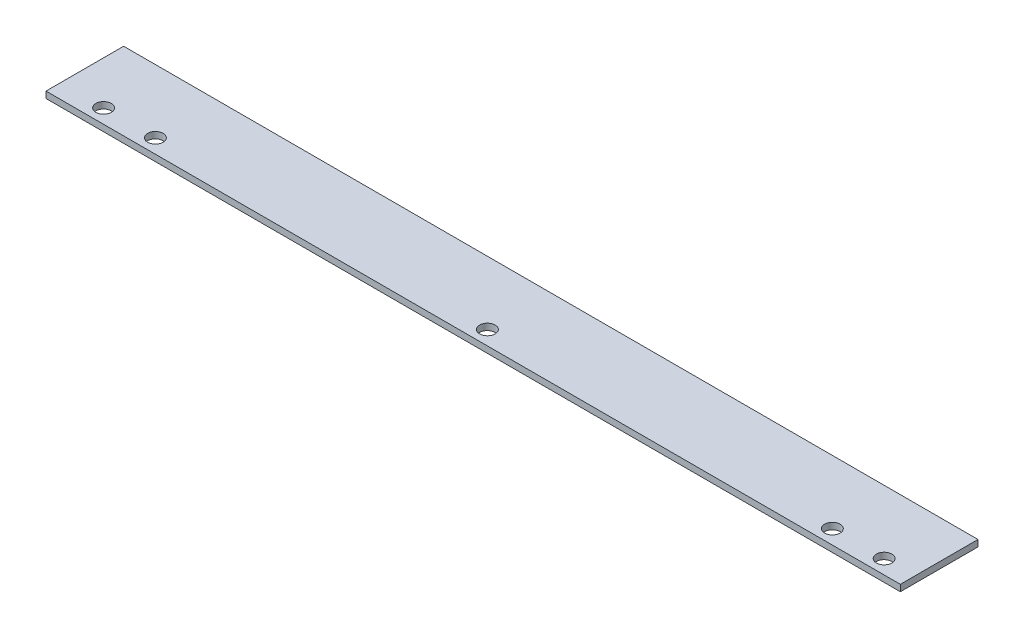
ISO-10303-21;
HEADER;
FILE_DESCRIPTION(('STEP AP214'),'2;1');
FILE_NAME('part.step','',(''),(''),'','','');
FILE_SCHEMA(('AUTOMOTIVE_DESIGN { 1 0 10303 214 1 1 1 1 }'));
ENDSEC;
DATA;
#1=APPLICATION_CONTEXT('core data for automotive mechanical design processes');
#2=APPLICATION_PROTOCOL_DEFINITION('international standard','automotive_design',2000,#1);
#3=PRODUCT_CONTEXT('',#1,'mechanical');
#4=PRODUCT('Part','Part','',(#3));
#5=PRODUCT_RELATED_PRODUCT_CATEGORY('part','',(#4));
#6=PRODUCT_DEFINITION_FORMATION('','',#4);
#7=PRODUCT_DEFINITION_CONTEXT('part definition',#1,'design');
#8=PRODUCT_DEFINITION('design','',#6,#7);
#9=PRODUCT_DEFINITION_SHAPE('','',#8);
#10=(LENGTH_UNIT() NAMED_UNIT(*) SI_UNIT(.MILLI.,.METRE.));
#11=(NAMED_UNIT(*) PLANE_ANGLE_UNIT() SI_UNIT($,.RADIAN.));
#12=(NAMED_UNIT(*) SI_UNIT($,.STERADIAN.) SOLID_ANGLE_UNIT());
#13=UNCERTAINTY_MEASURE_WITH_UNIT(LENGTH_MEASURE(1.E-05),#10,'distance_accuracy_value','');
#14=(GEOMETRIC_REPRESENTATION_CONTEXT(3) GLOBAL_UNCERTAINTY_ASSIGNED_CONTEXT((#13)) GLOBAL_UNIT_ASSIGNED_CONTEXT((#10,
#11,#12)) REPRESENTATION_CONTEXT('',''));
#15=CARTESIAN_POINT('',(0.,0.,0.));
#16=DIRECTION('',(0.,0.,1.));
#17=DIRECTION('',(1.,0.,0.));
#18=AXIS2_PLACEMENT_3D('',#15,#16,#17);
#19=CARTESIAN_POINT('',(0.,1.5875,0.));
#20=DIRECTION('',(0.,-1.,0.));
#21=DIRECTION('',(0.,0.,-1.));
#22=AXIS2_PLACEMENT_3D('',#19,#20,#21);
#23=PLANE('',#22);
#24=CARTESIAN_POINT('',(-94.1372366595265,1.5875,6.03492833681048));
#25=DIRECTION('',(0.,1.,0.));
#26=DIRECTION('',(0.,0.,1.));
#27=AXIS2_PLACEMENT_3D('',#24,#25,#26);
#28=CIRCLE('',#27,1.89865);
#29=CARTESIAN_POINT('',(-94.1372366595265,1.5875,7.93357833681048));
#30=VERTEX_POINT('',#29);
#31=EDGE_CURVE('E137',#30,#30,#28,.T.);
#32=ORIENTED_EDGE('',*,*,#31,.F.);
#33=EDGE_LOOP('',(#32));
#34=FACE_BOUND('',#33,.T.);
#35=CARTESIAN_POINT('',(-81.4372366595265,1.5875,6.03492833681048));
#36=DIRECTION('',(0.,1.,0.));
#37=DIRECTION('',(0.,0.,1.));
#38=AXIS2_PLACEMENT_3D('',#35,#36,#37);
#39=CIRCLE('',#38,1.89865);
#40=CARTESIAN_POINT('',(-81.4372366595265,1.5875,7.93357833681048));
#41=VERTEX_POINT('',#40);
#42=EDGE_CURVE('E119',#41,#41,#39,.T.);
#43=ORIENTED_EDGE('',*,*,#42,.F.);
#44=EDGE_LOOP('',(#43));
#45=FACE_BOUND('',#44,.T.);
#46=DIRECTION('',(0.,0.,-1.));
#47=VECTOR('',#46,1.);
#48=CARTESIAN_POINT('',(104.775,1.5875,9.525));
#49=LINE('',#48,#47);
#50=CARTESIAN_POINT('',(104.775,1.5875,9.525));
#51=VERTEX_POINT('',#50);
#52=CARTESIAN_POINT('',(104.775,1.5875,-9.525));
#53=VERTEX_POINT('',#52);
#54=EDGE_CURVE('E85',#51,#53,#49,.T.);
#55=ORIENTED_EDGE('',*,*,#54,.T.);
#56=DIRECTION('',(-1.,0.,0.));
#57=VECTOR('',#56,1.);
#58=CARTESIAN_POINT('',(-104.775,1.5875,-9.525));
#59=LINE('',#58,#57);
#60=CARTESIAN_POINT('',(-104.775,1.5875,-9.525));
#61=VERTEX_POINT('',#60);
#62=EDGE_CURVE('E80',#53,#61,#59,.T.);
#63=ORIENTED_EDGE('',*,*,#62,.T.);
#64=DIRECTION('',(0.,0.,1.));
#65=VECTOR('',#64,1.);
#66=CARTESIAN_POINT('',(-104.775,1.5875,9.525));
#67=LINE('',#66,#65);
#68=CARTESIAN_POINT('',(-104.775,1.5875,9.525));
#69=VERTEX_POINT('',#68);
#70=EDGE_CURVE('E83',#61,#69,#67,.T.);
#71=ORIENTED_EDGE('',*,*,#70,.T.);
#72=DIRECTION('',(1.,0.,0.));
#73=VECTOR('',#72,1.);
#74=CARTESIAN_POINT('',(-104.775,1.5875,9.525));
#75=LINE('',#74,#73);
#76=EDGE_CURVE('E50',#69,#51,#75,.T.);
#77=ORIENTED_EDGE('',*,*,#76,.T.);
#78=EDGE_LOOP('',(#55,#63,#71,#77));
#79=FACE_BOUND('',#78,.T.);
#80=CARTESIAN_POINT('',(84.6122366595264,1.5875,6.03492833681041));
#81=DIRECTION('',(0.,1.,0.));
#82=DIRECTION('',(0.,0.,1.));
#83=AXIS2_PLACEMENT_3D('',#80,#81,#82);
#84=CIRCLE('',#83,1.89865);
#85=CARTESIAN_POINT('',(84.6122366595264,1.5875,7.93357833681041));
#86=VERTEX_POINT('',#85);
#87=EDGE_CURVE('E113',#86,#86,#84,.T.);
#88=ORIENTED_EDGE('',*,*,#87,.F.);
#89=EDGE_LOOP('',(#88));
#90=FACE_BOUND('',#89,.T.);
#91=CARTESIAN_POINT('',(97.3122366595264,1.5875,6.03492833681037));
#92=DIRECTION('',(0.,1.,0.));
#93=DIRECTION('',(0.,0.,1.));
#94=AXIS2_PLACEMENT_3D('',#91,#92,#93);
#95=CIRCLE('',#94,1.89865);
#96=CARTESIAN_POINT('',(97.3122366595264,1.5875,7.93357833681037));
#97=VERTEX_POINT('',#96);
#98=EDGE_CURVE('E125',#97,#97,#95,.T.);
#99=ORIENTED_EDGE('',*,*,#98,.F.);
#100=EDGE_LOOP('',(#99));
#101=FACE_BOUND('',#100,.T.);
#102=CARTESIAN_POINT('',(0.,1.5875,6.03492833681039));
#103=DIRECTION('',(0.,1.,0.));
#104=DIRECTION('',(0.,0.,1.));
#105=AXIS2_PLACEMENT_3D('',#102,#103,#104);
#106=CIRCLE('',#105,1.89865);
#107=CARTESIAN_POINT('',(0.,1.5875,7.93357833681039));
#108=VERTEX_POINT('',#107);
#109=EDGE_CURVE('E131',#108,#108,#106,.T.);
#110=ORIENTED_EDGE('',*,*,#109,.F.);
#111=EDGE_LOOP('',(#110));
#112=FACE_BOUND('',#111,.T.);
#113=ADVANCED_FACE('F33',(#34,#45,#79,#90,#101,#112),#23,.F.);
#114=CARTESIAN_POINT('',(104.775,1.5875,9.525));
#115=DIRECTION('',(-1.,0.,0.));
#116=DIRECTION('',(0.,0.,1.));
#117=AXIS2_PLACEMENT_3D('',#114,#115,#116);
#118=PLANE('',#117);
#119=DIRECTION('',(0.,0.,-1.));
#120=VECTOR('',#119,1.);
#121=CARTESIAN_POINT('',(104.775,0.,9.525));
#122=LINE('',#121,#120);
#123=CARTESIAN_POINT('',(104.775,0.,9.525));
#124=VERTEX_POINT('',#123);
#125=CARTESIAN_POINT('',(104.775,0.,-9.525));
#126=VERTEX_POINT('',#125);
#127=EDGE_CURVE('E97',#124,#126,#122,.T.);
#128=ORIENTED_EDGE('',*,*,#127,.T.);
#129=DIRECTION('',(0.,-1.,0.));
#130=VECTOR('',#129,1.);
#131=CARTESIAN_POINT('',(104.775,1.5875,-9.525));
#132=LINE('',#131,#130);
#133=EDGE_CURVE('E11',#53,#126,#132,.T.);
#134=ORIENTED_EDGE('',*,*,#133,.F.);
#135=ORIENTED_EDGE('',*,*,#54,.F.);
#136=DIRECTION('',(0.,-1.,0.));
#137=VECTOR('',#136,1.);
#138=CARTESIAN_POINT('',(104.775,1.5875,9.525));
#139=LINE('',#138,#137);
#140=EDGE_CURVE('E93',#51,#124,#139,.T.);
#141=ORIENTED_EDGE('',*,*,#140,.T.);
#142=EDGE_LOOP('',(#128,#134,#135,#141));
#143=FACE_BOUND('',#142,.T.);
#144=ADVANCED_FACE('F35',(#143),#118,.F.);
#145=CARTESIAN_POINT('',(-104.775,1.5875,-9.525));
#146=DIRECTION('',(0.,0.,1.));
#147=DIRECTION('',(1.,0.,0.));
#148=AXIS2_PLACEMENT_3D('',#145,#146,#147);
#149=PLANE('',#148);
#150=DIRECTION('',(-1.,0.,0.));
#151=VECTOR('',#150,1.);
#152=CARTESIAN_POINT('',(-104.775,0.,-9.525));
#153=LINE('',#152,#151);
#154=CARTESIAN_POINT('',(-104.775,0.,-9.525));
#155=VERTEX_POINT('',#154);
#156=EDGE_CURVE('E89',#126,#155,#153,.T.);
#157=ORIENTED_EDGE('',*,*,#156,.T.);
#158=DIRECTION('',(0.,-1.,0.));
#159=VECTOR('',#158,1.);
#160=CARTESIAN_POINT('',(-104.775,1.5875,-9.525));
#161=LINE('',#160,#159);
#162=EDGE_CURVE('E42',#61,#155,#161,.T.);
#163=ORIENTED_EDGE('',*,*,#162,.F.);
#164=ORIENTED_EDGE('',*,*,#62,.F.);
#165=ORIENTED_EDGE('',*,*,#133,.T.);
#166=EDGE_LOOP('',(#157,#163,#164,#165));
#167=FACE_BOUND('',#166,.T.);
#168=ADVANCED_FACE('F88',(#167),#149,.F.);
#169=CARTESIAN_POINT('',(-104.775,1.5875,9.525));
#170=DIRECTION('',(1.,0.,0.));
#171=DIRECTION('',(0.,0.,-1.));
#172=AXIS2_PLACEMENT_3D('',#169,#170,#171);
#173=PLANE('',#172);
#174=DIRECTION('',(0.,0.,1.));
#175=VECTOR('',#174,1.);
#176=CARTESIAN_POINT('',(-104.775,0.,9.525));
#177=LINE('',#176,#175);
#178=CARTESIAN_POINT('',(-104.775,0.,9.525));
#179=VERTEX_POINT('',#178);
#180=EDGE_CURVE('E67',#155,#179,#177,.T.);
#181=ORIENTED_EDGE('',*,*,#180,.T.);
#182=DIRECTION('',(0.,-1.,0.));
#183=VECTOR('',#182,1.);
#184=CARTESIAN_POINT('',(-104.775,1.5875,9.525));
#185=LINE('',#184,#183);
#186=EDGE_CURVE('E90',#69,#179,#185,.T.);
#187=ORIENTED_EDGE('',*,*,#186,.F.);
#188=ORIENTED_EDGE('',*,*,#70,.F.);
#189=ORIENTED_EDGE('',*,*,#162,.T.);
#190=EDGE_LOOP('',(#181,#187,#188,#189));
#191=FACE_BOUND('',#190,.T.);
#192=ADVANCED_FACE('F91',(#191),#173,.F.);
#193=CARTESIAN_POINT('',(-104.775,1.5875,9.525));
#194=DIRECTION('',(0.,0.,-1.));
#195=DIRECTION('',(-1.,0.,0.));
#196=AXIS2_PLACEMENT_3D('',#193,#194,#195);
#197=PLANE('',#196);
#198=DIRECTION('',(1.,0.,0.));
#199=VECTOR('',#198,1.);
#200=CARTESIAN_POINT('',(-104.775,0.,9.525));
#201=LINE('',#200,#199);
#202=EDGE_CURVE('E73',#179,#124,#201,.T.);
#203=ORIENTED_EDGE('',*,*,#202,.T.);
#204=ORIENTED_EDGE('',*,*,#140,.F.);
#205=ORIENTED_EDGE('',*,*,#76,.F.);
#206=ORIENTED_EDGE('',*,*,#186,.T.);
#207=EDGE_LOOP('',(#203,#204,#205,#206));
#208=FACE_BOUND('',#207,.T.);
#209=ADVANCED_FACE('F105',(#208),#197,.F.);
#210=CARTESIAN_POINT('',(0.,0.,0.));
#211=DIRECTION('',(0.,-1.,0.));
#212=DIRECTION('',(0.,0.,-1.));
#213=AXIS2_PLACEMENT_3D('',#210,#211,#212);
#214=PLANE('',#213);
#215=CARTESIAN_POINT('',(-94.1372366595265,0.,6.03492833681048));
#216=DIRECTION('',(0.,-1.,0.));
#217=DIRECTION('',(0.,0.,-1.));
#218=AXIS2_PLACEMENT_3D('',#215,#216,#217);
#219=CIRCLE('',#218,1.89865);
#220=CARTESIAN_POINT('',(-94.1372366595265,0.,4.13627833681048));
#221=VERTEX_POINT('',#220);
#222=EDGE_CURVE('E134',#221,#221,#219,.T.);
#223=ORIENTED_EDGE('',*,*,#222,.F.);
#224=EDGE_LOOP('',(#223));
#225=FACE_BOUND('',#224,.T.);
#226=CARTESIAN_POINT('',(0.,0.,6.03492833681039));
#227=DIRECTION('',(0.,-1.,0.));
#228=DIRECTION('',(0.,0.,-1.));
#229=AXIS2_PLACEMENT_3D('',#226,#227,#228);
#230=CIRCLE('',#229,1.89865);
#231=CARTESIAN_POINT('',(0.,0.,4.13627833681039));
#232=VERTEX_POINT('',#231);
#233=EDGE_CURVE('E128',#232,#232,#230,.T.);
#234=ORIENTED_EDGE('',*,*,#233,.F.);
#235=EDGE_LOOP('',(#234));
#236=FACE_BOUND('',#235,.T.);
#237=CARTESIAN_POINT('',(97.3122366595264,0.,6.03492833681037));
#238=DIRECTION('',(0.,-1.,0.));
#239=DIRECTION('',(0.,0.,-1.));
#240=AXIS2_PLACEMENT_3D('',#237,#238,#239);
#241=CIRCLE('',#240,1.89865);
#242=CARTESIAN_POINT('',(97.3122366595264,0.,4.13627833681037));
#243=VERTEX_POINT('',#242);
#244=EDGE_CURVE('E122',#243,#243,#241,.T.);
#245=ORIENTED_EDGE('',*,*,#244,.F.);
#246=EDGE_LOOP('',(#245));
#247=FACE_BOUND('',#246,.T.);
#248=CARTESIAN_POINT('',(-81.4372366595265,0.,6.03492833681048));
#249=DIRECTION('',(0.,-1.,0.));
#250=DIRECTION('',(0.,0.,-1.));
#251=AXIS2_PLACEMENT_3D('',#248,#249,#250);
#252=CIRCLE('',#251,1.89865);
#253=CARTESIAN_POINT('',(-81.4372366595265,0.,4.13627833681048));
#254=VERTEX_POINT('',#253);
#255=EDGE_CURVE('E116',#254,#254,#252,.T.);
#256=ORIENTED_EDGE('',*,*,#255,.F.);
#257=EDGE_LOOP('',(#256));
#258=FACE_BOUND('',#257,.T.);
#259=CARTESIAN_POINT('',(84.6122366595264,0.,6.03492833681041));
#260=DIRECTION('',(0.,-1.,0.));
#261=DIRECTION('',(0.,0.,-1.));
#262=AXIS2_PLACEMENT_3D('',#259,#260,#261);
#263=CIRCLE('',#262,1.89865);
#264=CARTESIAN_POINT('',(84.6122366595264,0.,4.13627833681041));
#265=VERTEX_POINT('',#264);
#266=EDGE_CURVE('E100',#265,#265,#263,.T.);
#267=ORIENTED_EDGE('',*,*,#266,.F.);
#268=EDGE_LOOP('',(#267));
#269=FACE_BOUND('',#268,.T.);
#270=ORIENTED_EDGE('',*,*,#127,.F.);
#271=ORIENTED_EDGE('',*,*,#202,.F.);
#272=ORIENTED_EDGE('',*,*,#180,.F.);
#273=ORIENTED_EDGE('',*,*,#156,.F.);
#274=EDGE_LOOP('',(#270,#271,#272,#273));
#275=FACE_BOUND('',#274,.T.);
#276=ADVANCED_FACE('F108',(#225,#236,#247,#258,#269,#275),#214,.T.);
#277=CARTESIAN_POINT('',(84.6122366595264,1.5875,6.03492833681041));
#278=DIRECTION('',(0.,1.,0.));
#279=DIRECTION('',(0.,0.,1.));
#280=AXIS2_PLACEMENT_3D('',#277,#278,#279);
#281=CYLINDRICAL_SURFACE('',#280,1.89865);
#282=ORIENTED_EDGE('',*,*,#87,.T.);
#283=EDGE_LOOP('',(#282));
#284=FACE_BOUND('',#283,.T.);
#285=ORIENTED_EDGE('',*,*,#266,.T.);
#286=EDGE_LOOP('',(#285));
#287=FACE_BOUND('',#286,.T.);
#288=ADVANCED_FACE('F153',(#284,#287),#281,.F.);
#289=CARTESIAN_POINT('',(-81.4372366595265,1.5875,6.03492833681048));
#290=DIRECTION('',(0.,1.,0.));
#291=DIRECTION('',(0.,0.,1.));
#292=AXIS2_PLACEMENT_3D('',#289,#290,#291);
#293=CYLINDRICAL_SURFACE('',#292,1.89865);
#294=ORIENTED_EDGE('',*,*,#42,.T.);
#295=EDGE_LOOP('',(#294));
#296=FACE_BOUND('',#295,.T.);
#297=ORIENTED_EDGE('',*,*,#255,.T.);
#298=EDGE_LOOP('',(#297));
#299=FACE_BOUND('',#298,.T.);
#300=ADVANCED_FACE('F149',(#296,#299),#293,.F.);
#301=CARTESIAN_POINT('',(97.3122366595264,1.5875,6.03492833681037));
#302=DIRECTION('',(0.,1.,0.));
#303=DIRECTION('',(0.,0.,1.));
#304=AXIS2_PLACEMENT_3D('',#301,#302,#303);
#305=CYLINDRICAL_SURFACE('',#304,1.89865);
#306=ORIENTED_EDGE('',*,*,#98,.T.);
#307=EDGE_LOOP('',(#306));
#308=FACE_BOUND('',#307,.T.);
#309=ORIENTED_EDGE('',*,*,#244,.T.);
#310=EDGE_LOOP('',(#309));
#311=FACE_BOUND('',#310,.T.);
#312=ADVANCED_FACE('F152',(#308,#311),#305,.F.);
#313=CARTESIAN_POINT('',(0.,1.5875,6.03492833681039));
#314=DIRECTION('',(0.,1.,0.));
#315=DIRECTION('',(0.,0.,1.));
#316=AXIS2_PLACEMENT_3D('',#313,#314,#315);
#317=CYLINDRICAL_SURFACE('',#316,1.89865);
#318=ORIENTED_EDGE('',*,*,#109,.T.);
#319=EDGE_LOOP('',(#318));
#320=FACE_BOUND('',#319,.T.);
#321=ORIENTED_EDGE('',*,*,#233,.T.);
#322=EDGE_LOOP('',(#321));
#323=FACE_BOUND('',#322,.T.);
#324=ADVANCED_FACE('F212',(#320,#323),#317,.F.);
#325=CARTESIAN_POINT('',(-94.1372366595265,1.5875,6.03492833681048));
#326=DIRECTION('',(0.,1.,0.));
#327=DIRECTION('',(0.,0.,1.));
#328=AXIS2_PLACEMENT_3D('',#325,#326,#327);
#329=CYLINDRICAL_SURFACE('',#328,1.89865);
#330=ORIENTED_EDGE('',*,*,#31,.T.);
#331=EDGE_LOOP('',(#330));
#332=FACE_BOUND('',#331,.T.);
#333=ORIENTED_EDGE('',*,*,#222,.T.);
#334=EDGE_LOOP('',(#333));
#335=FACE_BOUND('',#334,.T.);
#336=ADVANCED_FACE('F141',(#332,#335),#329,.F.);
#337=CLOSED_SHELL('',(#113,#144,#168,#192,#209,#276,#288,#300,#312,#324,#336));
#338=MANIFOLD_SOLID_BREP('B2',#337);
#339=ADVANCED_BREP_SHAPE_REPRESENTATION('',(#18,#338),#14);
#340=SHAPE_DEFINITION_REPRESENTATION(#9,#339);
ENDSEC;
END-ISO-10303-21;
